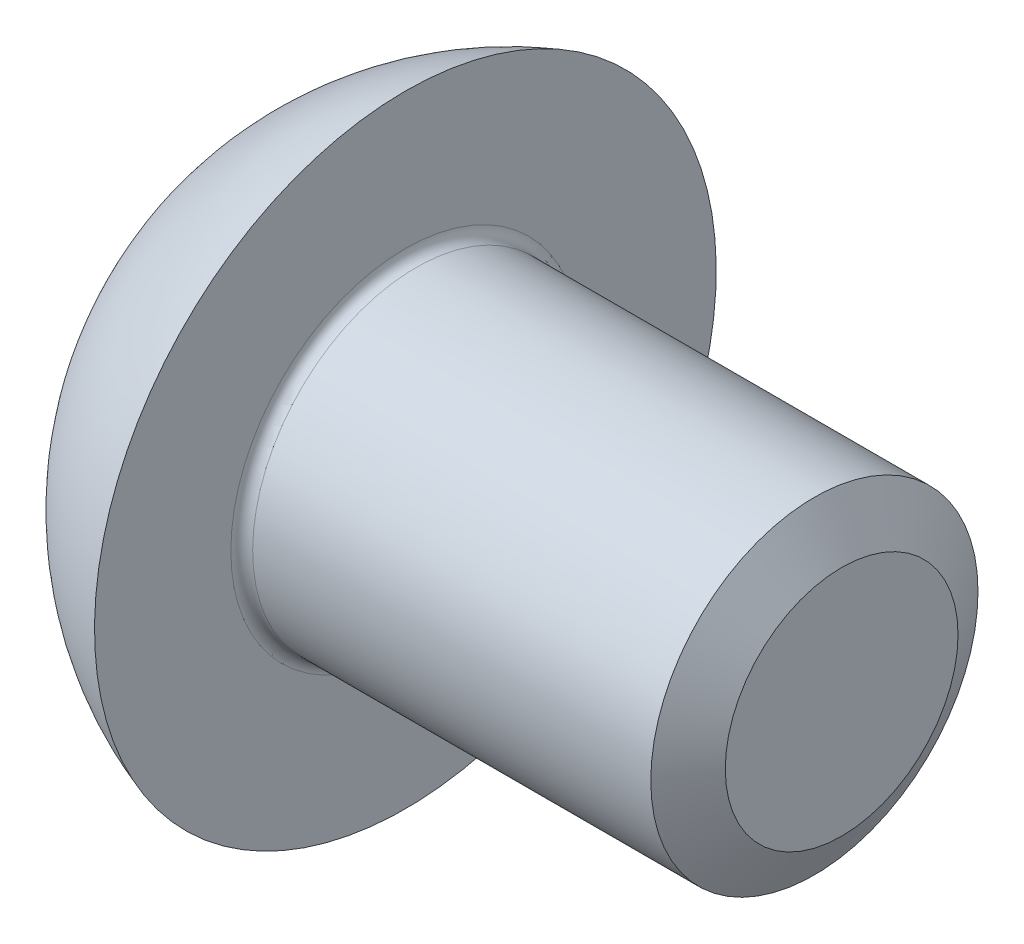
ISO-10303-21;
HEADER;
FILE_DESCRIPTION(('STEP AP214'),'2;1');
FILE_NAME('part.step','',(''),(''),'','','');
FILE_SCHEMA(('AUTOMOTIVE_DESIGN { 1 0 10303 214 1 1 1 1 }'));
ENDSEC;
DATA;
#1=APPLICATION_CONTEXT('core data for automotive mechanical design processes');
#2=APPLICATION_PROTOCOL_DEFINITION('international standard','automotive_design',2000,#1);
#3=PRODUCT_CONTEXT('',#1,'mechanical');
#4=PRODUCT('Part','Part','',(#3));
#5=PRODUCT_RELATED_PRODUCT_CATEGORY('part','',(#4));
#6=PRODUCT_DEFINITION_FORMATION('','',#4);
#7=PRODUCT_DEFINITION_CONTEXT('part definition',#1,'design');
#8=PRODUCT_DEFINITION('design','',#6,#7);
#9=PRODUCT_DEFINITION_SHAPE('','',#8);
#10=(LENGTH_UNIT() NAMED_UNIT(*) SI_UNIT(.MILLI.,.METRE.));
#11=(NAMED_UNIT(*) PLANE_ANGLE_UNIT() SI_UNIT($,.RADIAN.));
#12=(NAMED_UNIT(*) SI_UNIT($,.STERADIAN.) SOLID_ANGLE_UNIT());
#13=UNCERTAINTY_MEASURE_WITH_UNIT(LENGTH_MEASURE(1.E-05),#10,'distance_accuracy_value','');
#14=(GEOMETRIC_REPRESENTATION_CONTEXT(3) GLOBAL_UNCERTAINTY_ASSIGNED_CONTEXT((#13)) GLOBAL_UNIT_ASSIGNED_CONTEXT((#10,
#11,#12)) REPRESENTATION_CONTEXT('',''));
#15=CARTESIAN_POINT('',(0.,0.,0.));
#16=DIRECTION('',(0.,0.,1.));
#17=DIRECTION('',(1.,0.,0.));
#18=AXIS2_PLACEMENT_3D('',#15,#16,#17);
#19=CARTESIAN_POINT('',(-5.65,0.,0.));
#20=DIRECTION('',(-1.,0.,0.));
#21=DIRECTION('',(0.,0.,1.));
#22=AXIS2_PLACEMENT_3D('',#19,#20,#21);
#23=CYLINDRICAL_SURFACE('',#22,1.5);
#24=CARTESIAN_POINT('',(-3.9,0.,0.));
#25=DIRECTION('',(-1.,0.,0.));
#26=DIRECTION('',(0.,0.,1.));
#27=AXIS2_PLACEMENT_3D('',#24,#25,#26);
#28=CIRCLE('',#27,1.5);
#29=CARTESIAN_POINT('',(-3.9,0.,1.5));
#30=VERTEX_POINT('',#29);
#31=EDGE_CURVE('E248',#30,#30,#28,.T.);
#32=ORIENTED_EDGE('',*,*,#31,.F.);
#33=EDGE_LOOP('',(#32));
#34=FACE_BOUND('',#33,.T.);
#35=CARTESIAN_POINT('',(-0.25,0.,0.));
#36=DIRECTION('',(-1.,0.,0.));
#37=DIRECTION('',(0.,0.,1.));
#38=AXIS2_PLACEMENT_3D('',#35,#36,#37);
#39=CIRCLE('',#38,1.5);
#40=CARTESIAN_POINT('',(-0.25,0.,1.5));
#41=VERTEX_POINT('',#40);
#42=EDGE_CURVE('E387',#41,#41,#39,.T.);
#43=ORIENTED_EDGE('',*,*,#42,.T.);
#44=EDGE_LOOP('',(#43));
#45=FACE_BOUND('',#44,.T.);
#46=ADVANCED_FACE('F36',(#34,#45),#23,.T.);
#47=CARTESIAN_POINT('',(-5.65,0.,0.));
#48=DIRECTION('',(1.,0.,0.));
#49=DIRECTION('',(0.,0.,-1.));
#50=AXIS2_PLACEMENT_3D('',#47,#48,#49);
#51=PLANE('',#50);
#52=CARTESIAN_POINT('',(-5.65,0.,0.));
#53=DIRECTION('',(-1.,0.,0.));
#54=DIRECTION('',(0.,0.,1.));
#55=AXIS2_PLACEMENT_3D('',#52,#53,#54);
#56=CIRCLE('',#55,1.5);
#57=CARTESIAN_POINT('',(-5.65,1.5,0.));
#58=VERTEX_POINT('',#57);
#59=EDGE_CURVE('E240',#58,#58,#56,.T.);
#60=ORIENTED_EDGE('',*,*,#59,.T.);
#61=EDGE_LOOP('',(#60));
#62=FACE_BOUND('',#61,.T.);
#63=CARTESIAN_POINT('',(-5.65,0.,0.));
#64=DIRECTION('',(1.,0.,0.));
#65=DIRECTION('',(0.,0.,-1.));
#66=AXIS2_PLACEMENT_3D('',#63,#64,#65);
#67=CIRCLE('',#66,1.15470053837925);
#68=CARTESIAN_POINT('',(-5.65,-0.577350269189626,-1.));
#69=VERTEX_POINT('',#68);
#70=CARTESIAN_POINT('',(-5.65,-1.15470053837925,0.));
#71=VERTEX_POINT('',#70);
#72=EDGE_CURVE('E11',#69,#71,#67,.F.);
#73=ORIENTED_EDGE('',*,*,#72,.F.);
#74=CARTESIAN_POINT('',(-5.65,0.577350269189626,-1.));
#75=VERTEX_POINT('',#74);
#76=EDGE_CURVE('E40',#75,#69,#67,.F.);
#77=ORIENTED_EDGE('',*,*,#76,.F.);
#78=CARTESIAN_POINT('',(-5.65,1.15470053837925,0.));
#79=VERTEX_POINT('',#78);
#80=EDGE_CURVE('E109',#79,#75,#67,.F.);
#81=ORIENTED_EDGE('',*,*,#80,.F.);
#82=CARTESIAN_POINT('',(-5.65,0.,0.));
#83=DIRECTION('',(-1.,0.,0.));
#84=DIRECTION('',(0.,0.,1.));
#85=AXIS2_PLACEMENT_3D('',#82,#83,#84);
#86=CIRCLE('',#85,1.15470053837925);
#87=CARTESIAN_POINT('',(-5.65,0.577350269189627,1.));
#88=VERTEX_POINT('',#87);
#89=EDGE_CURVE('E129',#88,#79,#86,.T.);
#90=ORIENTED_EDGE('',*,*,#89,.F.);
#91=CARTESIAN_POINT('',(-5.65,-0.577350269189627,1.));
#92=VERTEX_POINT('',#91);
#93=EDGE_CURVE('E311',#92,#88,#67,.F.);
#94=ORIENTED_EDGE('',*,*,#93,.F.);
#95=EDGE_CURVE('E45',#71,#92,#67,.F.);
#96=ORIENTED_EDGE('',*,*,#95,.F.);
#97=EDGE_LOOP('',(#73,#77,#81,#90,#94,#96));
#98=FACE_BOUND('',#97,.T.);
#99=ADVANCED_FACE('F38',(#62,#98),#51,.F.);
#100=CARTESIAN_POINT('',(-3.04545454545455,0.,0.));
#101=DIRECTION('',(-1.,0.,0.));
#102=DIRECTION('',(0.,1.,0.));
#103=AXIS2_PLACEMENT_3D('',#100,#101,#102);
#104=SPHERICAL_SURFACE('',#103,3.00560426949281);
#105=CARTESIAN_POINT('',(-4.,0.,0.));
#106=DIRECTION('',(-1.,0.,0.));
#107=DIRECTION('',(0.,0.,1.));
#108=AXIS2_PLACEMENT_3D('',#105,#106,#107);
#109=CIRCLE('',#108,2.85);
#110=CARTESIAN_POINT('',(-4.,2.85,0.));
#111=VERTEX_POINT('',#110);
#112=EDGE_CURVE('E243',#111,#111,#109,.T.);
#113=CARTESIAN_POINT('',(-5.65,1.5,0.));
#114=CARTESIAN_POINT('',(-5.6386705331495,1.51967216925548,0.));
#115=CARTESIAN_POINT('',(-5.62711811082355,1.53921593268644,0.));
#116=CARTESIAN_POINT('',(-5.60357346441957,1.57803672196104,0.));
#117=CARTESIAN_POINT('',(-5.59158124034154,1.59731374780469,0.));
#118=CARTESIAN_POINT('',(-5.56716309963224,1.6355911359664,0.));
#119=CARTESIAN_POINT('',(-5.55473718300098,1.65459149828447,0.));
#120=CARTESIAN_POINT('',(-5.52945804954812,1.69230581219271,0.));
#121=CARTESIAN_POINT('',(-5.51660483272654,1.7110197637829,0.));
#122=CARTESIAN_POINT('',(-5.49047769442416,1.74815164624667,0.));
#123=CARTESIAN_POINT('',(-5.47720377294336,1.76656957712027,0.));
#124=CARTESIAN_POINT('',(-5.45024204119108,1.80309996277641,0.));
#125=CARTESIAN_POINT('',(-5.43655423091961,1.82121241755895,0.));
#126=CARTESIAN_POINT('',(-5.40877174878479,1.85712255178676,0.));
#127=CARTESIAN_POINT('',(-5.39467707692146,1.87492023123203,0.));
#128=CARTESIAN_POINT('',(-5.36608810800002,1.91019167733672,0.));
#129=CARTESIAN_POINT('',(-5.35159381094191,1.92766544399614,0.));
#130=CARTESIAN_POINT('',(-5.32221303311564,1.96228009332959,0.));
#131=CARTESIAN_POINT('',(-5.30732655234746,1.97942097600363,0.));
#132=CARTESIAN_POINT('',(-5.27716904995876,2.013361057086,0.));
#133=CARTESIAN_POINT('',(-5.26189802833824,2.03016025549433,0.));
#134=CARTESIAN_POINT('',(-5.2309792845233,2.06340834318511,0.));
#135=CARTESIAN_POINT('',(-5.21533156232888,2.07985723246756,0.));
#136=CARTESIAN_POINT('',(-5.18366745104768,2.11239625689921,0.));
#137=CARTESIAN_POINT('',(-5.16765106196089,2.12848639204841,0.));
#138=CARTESIAN_POINT('',(-5.13525783985292,2.16029964739355,0.));
#139=CARTESIAN_POINT('',(-5.11888100683174,2.17602276758948,0.));
#140=CARTESIAN_POINT('',(-5.08577530486826,2.2070939206369,0.));
#141=CARTESIAN_POINT('',(-5.06904643592596,2.22244195348839,0.));
#142=CARTESIAN_POINT('',(-5.03524525087184,2.25275505202893,0.));
#143=CARTESIAN_POINT('',(-5.01817293476004,2.26772011771799,0.));
#144=CARTESIAN_POINT('',(-4.98369362044743,2.29725959873447,0.));
#145=CARTESIAN_POINT('',(-4.96628662224662,2.3118340140619,0.));
#146=CARTESIAN_POINT('',(-4.93114688066531,2.34058471171934,0.));
#147=CARTESIAN_POINT('',(-4.9134141372848,2.35476099404935,0.));
#148=CARTESIAN_POINT('',(-4.87763200949386,2.38270814748122,0.));
#149=CARTESIAN_POINT('',(-4.85958262508344,2.39647901858308,0.));
#150=CARTESIAN_POINT('',(-4.82317648194882,2.42360827946968,0.));
#151=CARTESIAN_POINT('',(-4.80481972322463,2.43696666925442,0.));
#152=CARTESIAN_POINT('',(-4.76780825598736,2.46326410918943,0.));
#153=CARTESIAN_POINT('',(-4.74915354747428,2.4762031593397,0.));
#154=CARTESIAN_POINT('',(-4.7115557581542,2.50165527698115,0.));
#155=CARTESIAN_POINT('',(-4.69261267734721,2.51416834447232,0.));
#156=CARTESIAN_POINT('',(-4.65444786898723,2.53876207247436,0.));
#157=CARTESIAN_POINT('',(-4.63522614143426,2.55084273298524,0.));
#158=CARTESIAN_POINT('',(-4.59651390818984,2.57456544470666,0.));
#159=CARTESIAN_POINT('',(-4.5770234024984,2.5862074959172,0.));
#160=CARTESIAN_POINT('',(-4.53778361957831,2.60904701190566,0.));
#161=CARTESIAN_POINT('',(-4.51803434234967,2.62024447668356,0.));
#162=CARTESIAN_POINT('',(-4.4782871558097,2.6421890709225,0.));
#163=CARTESIAN_POINT('',(-4.45828924649837,2.65293620038353,0.));
#164=CARTESIAN_POINT('',(-4.41805506290636,2.67397460633529,0.));
#165=CARTESIAN_POINT('',(-4.39781878862568,2.68426588282604,0.));
#166=CARTESIAN_POINT('',(-4.3571182645539,2.70438729913089,0.));
#167=CARTESIAN_POINT('',(-4.3366540147628,2.714217438945,0.));
#168=CARTESIAN_POINT('',(-4.29550804629742,2.73341153528513,0.));
#169=CARTESIAN_POINT('',(-4.27482632762314,2.74277549181114,0.));
#170=CARTESIAN_POINT('',(-4.23325603920768,2.7610324130256,0.));
#171=CARTESIAN_POINT('',(-4.2123674694665,2.76992537771405,0.));
#172=CARTESIAN_POINT('',(-4.17039420465488,2.78723575329491,0.));
#173=CARTESIAN_POINT('',(-4.14930950958444,2.79565316418733,0.));
#174=CARTESIAN_POINT('',(-4.10695481411716,2.81200809653372,0.));
#175=CARTESIAN_POINT('',(-4.08568481372031,2.8199456179877,0.));
#176=CARTESIAN_POINT('',(-4.04297044672759,2.83533674876495,0.));
#177=CARTESIAN_POINT('',(-4.02152608013171,2.84279035808822,0.));
#178=CARTESIAN_POINT('',(-4.,2.85,0.));
#179=B_SPLINE_CURVE_WITH_KNOTS('',3,(#113,#114,#115,#116,#117,#118,#119,#120,#121,#122,#123,
#124,#125,#126,#127,#128,#129,#130,#131,#132,#133,#134,#135,#136,#137,#138,#139,#140,#141,#142,
#143,#144,#145,#146,#147,#148,#149,#150,#151,#152,#153,#154,#155,#156,#157,#158,#159,#160,#161,
#162,#163,#164,#165,#166,#167,#168,#169,#170,#171,#172,#173,#174,#175,#176,#177,#178),
.UNSPECIFIED.,.F.,.F.,(4,2,2,2,2,2,2,2,2,2,2,2,2,2,2,2,2,2,2,2,2,2,2,2,2,2,2,2,2,2,2,2,4),(0.,
0.0681025747754097,0.13620514955082,0.204307724326229,0.272410299101638,0.340512873877048,
0.408615448652458,0.476718023427867,0.544820598203277,0.612923172978687,0.681025747754096,
0.749128322529506,0.817230897304915,0.885333472080325,0.953436046855735,1.02153862163114,
1.08964119640655,1.15774377118196,1.22584634595737,1.29394892073278,1.36205149550819,
1.4301540702836,1.49825664505901,1.56635921983442,1.63446179460983,1.70256436938524,
1.77066694416065,1.83876951893606,1.90687209371147,1.97497466848688,2.04307724326229,
2.1111798180377,2.17928239281311),.UNSPECIFIED.);
#180=EDGE_CURVE('BSEAM229',#58,#111,#179,.T.);
#181=ORIENTED_EDGE('',*,*,#59,.F.);
#182=ORIENTED_EDGE('',*,*,#112,.T.);
#183=ORIENTED_EDGE('',*,*,#180,.T.);
#184=ORIENTED_EDGE('',*,*,#180,.F.);
#185=EDGE_LOOP('',(#181,#183,#182,#184));
#186=FACE_BOUND('',#185,.T.);
#187=ADVANCED_FACE('F229',(#186),#104,.T.);
#188=CARTESIAN_POINT('',(-4.,1.6,0.));
#189=DIRECTION('',(-1.,0.,0.));
#190=DIRECTION('',(0.,0.,1.));
#191=AXIS2_PLACEMENT_3D('',#188,#189,#190);
#192=PLANE('',#191);
#193=ORIENTED_EDGE('',*,*,#112,.F.);
#194=EDGE_LOOP('',(#193));
#195=FACE_BOUND('',#194,.T.);
#196=CARTESIAN_POINT('',(-4.,0.,0.));
#197=DIRECTION('',(-1.,0.,0.));
#198=DIRECTION('',(0.,0.,1.));
#199=AXIS2_PLACEMENT_3D('',#196,#197,#198);
#200=CIRCLE('',#199,1.6);
#201=CARTESIAN_POINT('',(-4.,0.,1.6));
#202=VERTEX_POINT('',#201);
#203=EDGE_CURVE('E244',#202,#202,#200,.T.);
#204=ORIENTED_EDGE('',*,*,#203,.T.);
#205=EDGE_LOOP('',(#204));
#206=FACE_BOUND('',#205,.T.);
#207=ADVANCED_FACE('F226',(#195,#206),#192,.F.);
#208=CARTESIAN_POINT('',(-3.9,0.,0.));
#209=DIRECTION('',(-1.,0.,0.));
#210=DIRECTION('',(0.,0.,1.));
#211=AXIS2_PLACEMENT_3D('',#208,#209,#210);
#212=TOROIDAL_SURFACE('',#211,1.6,0.1);
#213=ORIENTED_EDGE('',*,*,#203,.F.);
#214=EDGE_LOOP('',(#213));
#215=FACE_BOUND('',#214,.T.);
#216=ORIENTED_EDGE('',*,*,#31,.T.);
#217=EDGE_LOOP('',(#216));
#218=FACE_BOUND('',#217,.T.);
#219=ADVANCED_FACE('F223',(#215,#218),#212,.F.);
#220=CARTESIAN_POINT('',(-5.35,0.,0.));
#221=DIRECTION('',(-1.,0.,0.));
#222=DIRECTION('',(0.,0.,1.));
#223=AXIS2_PLACEMENT_3D('',#220,#221,#222);
#224=CONICAL_SURFACE('',#223,0.,1.31660847419538);
#225=CARTESIAN_POINT('',(-5.82013380620057,-1.50813004514732,-1.));
#226=CARTESIAN_POINT('',(-5.8103550434819,-1.46296169562474,-1.));
#227=CARTESIAN_POINT('',(-5.80070106345438,-1.41776633026117,-1.));
#228=CARTESIAN_POINT('',(-5.78170572496956,-1.32730802014364,-1.));
#229=CARTESIAN_POINT('',(-5.77236437982312,-1.28204507259777,-1.));
#230=CARTESIAN_POINT('',(-5.74488770712419,-1.14605409329119,-1.));
#231=CARTESIAN_POINT('',(-5.72731859349988,-1.05520983561614,-1.));
#232=CARTESIAN_POINT('',(-5.69461131204395,-0.873838301576798,-1.));
#233=CARTESIAN_POINT('',(-5.67945456692474,-0.7833144391517,-1.));
#234=CARTESIAN_POINT('',(-5.65260008692449,-0.6017545449599,-1.));
#235=CARTESIAN_POINT('',(-5.64090169604817,-0.510718613667323,-1.));
#236=CARTESIAN_POINT('',(-5.62246881045803,-0.327147289356503,-1.));
#237=CARTESIAN_POINT('',(-5.61578776188075,-0.234606191513628,-1.));
#238=CARTESIAN_POINT('',(-5.60903683627844,-0.0493046545659397,-1.));
#239=CARTESIAN_POINT('',(-5.60896400245972,0.0434556678685438,-1.));
#240=CARTESIAN_POINT('',(-5.61545349340013,0.229083736366357,-1.));
#241=CARTESIAN_POINT('',(-5.62204147369897,0.321950511068641,-1.));
#242=CARTESIAN_POINT('',(-5.64045721399818,0.507192547760969,-1.));
#243=CARTESIAN_POINT('',(-5.65228848162608,0.599567438757552,-1.));
#244=CARTESIAN_POINT('',(-5.67981183132388,0.785811374464127,-1.));
#245=CARTESIAN_POINT('',(-5.69558360308727,0.879668211118268,-1.));
#246=CARTESIAN_POINT('',(-5.72952329669545,1.06695285362325,-1.));
#247=CARTESIAN_POINT('',(-5.74769157874278,1.1603805927907,-1.));
#248=CARTESIAN_POINT('',(-5.78558531632585,1.34694314931586,-1.));
#249=CARTESIAN_POINT('',(-5.80531120299549,1.44007787810024,-1.));
#250=CARTESIAN_POINT('',(-5.84579713231761,1.62612272775573,-1.));
#251=CARTESIAN_POINT('',(-5.86655719608256,1.71903284400079,-1.));
#252=CARTESIAN_POINT('',(-5.90854857428718,1.903637427562,-1.));
#253=CARTESIAN_POINT('',(-5.92977186893612,1.9953337266767,-1.));
#254=CARTESIAN_POINT('',(-5.97271430581896,2.17861191613063,-1.));
#255=CARTESIAN_POINT('',(-5.99443345860857,2.27019380399046,-1.));
#256=CARTESIAN_POINT('',(-6.03820424205131,2.45314970808009,-1.));
#257=CARTESIAN_POINT('',(-6.06025539436552,2.5445238389853,-1.));
#258=CARTESIAN_POINT('',(-6.10463324721372,2.72720190611077,-1.));
#259=CARTESIAN_POINT('',(-6.12695993831944,2.8185058446199,-1.));
#260=CARTESIAN_POINT('',(-6.14938266954955,2.90978592155446,-1.));
#261=B_SPLINE_CURVE_WITH_KNOTS('',3,(#225,#226,#227,#228,#229,#230,#231,#232,#233,#234,#235,
#236,#237,#238,#239,#240,#241,#242,#243,#244,#245,#246,#247,#248,#249,#250,#251,#252,#253,#254,
#255,#256,#257,#258,#259,#260),.UNSPECIFIED.,.F.,.F.,(4,2,2,2,2,2,2,2,2,2,2,2,2,2,2,2,2,4),(0.,
0.138643869904216,0.27729363526202,0.554857004575374,0.830167022867761,1.1054247856322,
1.38357462949425,1.66160001678322,1.94070037290081,2.2199877226546,2.50545939054028,
2.79097401465123,3.07656794608524,3.36216771024121,3.64452690734654,3.92689212086077,
4.20888343572446,4.49086512814071),.UNSPECIFIED.);
#262=EDGE_CURVE('E100',#69,#75,#261,.T.);
#263=ORIENTED_EDGE('',*,*,#262,.T.);
#264=ORIENTED_EDGE('',*,*,#76,.T.);
#265=EDGE_LOOP('',(#263,#264));
#266=FACE_BOUND('',#265,.T.);
#267=ADVANCED_FACE('F104',(#266),#224,.F.);
#268=CARTESIAN_POINT('',(-5.65003000449955,0.577234799135788,-1.0002));
#269=CARTESIAN_POINT('',(-5.64379291920422,0.6012250217386,-0.958647715567044));
#270=CARTESIAN_POINT('',(-5.63813137861672,0.625256195021441,-0.917024502475671));
#271=CARTESIAN_POINT('',(-5.62818542172232,0.673398386330439,-0.833639781140784));
#272=CARTESIAN_POINT('',(-5.6239015302713,0.697509431260084,-0.791878226299064));
#273=CARTESIAN_POINT('',(-5.61695890316674,0.745673772514855,-0.708455140132714));
#274=CARTESIAN_POINT('',(-5.6142923745456,0.769726780462717,-0.666794108292159));
#275=CARTESIAN_POINT('',(-5.61071689299408,0.817861664223349,-0.583422044002323));
#276=CARTESIAN_POINT('',(-5.60980762113533,0.841943534003894,-0.541711022001161));
#277=CARTESIAN_POINT('',(-5.60980762113533,0.890107273564984,-0.458288977998839));
#278=CARTESIAN_POINT('',(-5.61071689299408,0.914189143345529,-0.416577955997677));
#279=CARTESIAN_POINT('',(-5.6142923745456,0.962324027106161,-0.333205891707841));
#280=CARTESIAN_POINT('',(-5.61695890316674,0.986377035054023,-0.291544859867286));
#281=CARTESIAN_POINT('',(-5.6239015302713,1.03454137630879,-0.208121773700936));
#282=CARTESIAN_POINT('',(-5.62818542172232,1.05865242123844,-0.166360218859216));
#283=CARTESIAN_POINT('',(-5.63813137861672,1.10679461254744,-0.0829754975243291));
#284=CARTESIAN_POINT('',(-5.64379291920422,1.13082578583028,-0.0413522844329564));
#285=CARTESIAN_POINT('',(-5.65003000449955,1.15481600843309,0.000199999999999949));
#286=B_SPLINE_CURVE_WITH_KNOTS('',3,(#268,#269,#270,#271,#272,#273,#274,#275,#276,#277,#278,
#279,#280,#281,#282,#283,#284,#285),.UNSPECIFIED.,.F.,.F.,(4,2,2,2,2,2,2,2,4),(0.,
0.145159524820137,0.290374287087485,0.434883682122849,0.57936684736763,0.723850012612412,
0.868359407647776,1.01357416991512,1.15873369473526),.UNSPECIFIED.);
#287=EDGE_CURVE('E127',#75,#79,#286,.T.);
#288=ORIENTED_EDGE('',*,*,#287,.T.);
#289=ORIENTED_EDGE('',*,*,#80,.T.);
#290=EDGE_LOOP('',(#288,#289));
#291=FACE_BOUND('',#290,.T.);
#292=ADVANCED_FACE('F153',(#291),#224,.F.);
#293=CARTESIAN_POINT('',(-5.65003000449955,1.15481600843309,-0.000199999999999906));
#294=CARTESIAN_POINT('',(-5.64379291920422,1.13082578583028,0.0413522844329562));
#295=CARTESIAN_POINT('',(-5.63813137861672,1.10679461254744,0.0829754975243289));
#296=CARTESIAN_POINT('',(-5.62818542172232,1.05865242123844,0.166360218859216));
#297=CARTESIAN_POINT('',(-5.6239015302713,1.03454137630879,0.208121773700936));
#298=CARTESIAN_POINT('',(-5.61695890316674,0.986377035054023,0.291544859867286));
#299=CARTESIAN_POINT('',(-5.6142923745456,0.962324027106161,0.333205891707841));
#300=CARTESIAN_POINT('',(-5.61071689299408,0.914189143345529,0.416577955997677));
#301=CARTESIAN_POINT('',(-5.60980762113533,0.890107273564984,0.458288977998838));
#302=CARTESIAN_POINT('',(-5.60980762113533,0.841943534003894,0.541711022001161));
#303=CARTESIAN_POINT('',(-5.61071689299408,0.817861664223349,0.583422044002323));
#304=CARTESIAN_POINT('',(-5.6142923745456,0.769726780462718,0.666794108292159));
#305=CARTESIAN_POINT('',(-5.61695890316674,0.745673772514856,0.708455140132714));
#306=CARTESIAN_POINT('',(-5.6239015302713,0.697509431260084,0.791878226299063));
#307=CARTESIAN_POINT('',(-5.62818542172232,0.67339838633044,0.833639781140784));
#308=CARTESIAN_POINT('',(-5.63813137861672,0.625256195021441,0.917024502475671));
#309=CARTESIAN_POINT('',(-5.64379291920422,0.6012250217386,0.958647715567044));
#310=CARTESIAN_POINT('',(-5.65003000449955,0.577234799135789,1.0002));
#311=B_SPLINE_CURVE_WITH_KNOTS('',3,(#293,#294,#295,#296,#297,#298,#299,#300,#301,#302,#303,
#304,#305,#306,#307,#308,#309,#310),.UNSPECIFIED.,.F.,.F.,(4,2,2,2,2,2,2,2,4),(0.,
0.145159524820137,0.290374287087485,0.434883682122849,0.57936684736763,0.723850012612411,
0.868359407647776,1.01357416991512,1.15873369473526),.UNSPECIFIED.);
#312=EDGE_CURVE('E173',#79,#88,#311,.T.);
#313=ORIENTED_EDGE('',*,*,#312,.T.);
#314=ORIENTED_EDGE('',*,*,#89,.T.);
#315=EDGE_LOOP('',(#313,#314));
#316=FACE_BOUND('',#315,.T.);
#317=ADVANCED_FACE('F147',(#316),#224,.F.);
#318=CARTESIAN_POINT('',(-5.82013380620057,-1.50813004514732,1.));
#319=CARTESIAN_POINT('',(-5.8103550434819,-1.46296169562475,1.));
#320=CARTESIAN_POINT('',(-5.80070106345438,-1.41776633026117,1.));
#321=CARTESIAN_POINT('',(-5.78170572496956,-1.32730802014364,1.));
#322=CARTESIAN_POINT('',(-5.77236437982312,-1.28204507259777,1.));
#323=CARTESIAN_POINT('',(-5.74488770712419,-1.14605409329119,1.));
#324=CARTESIAN_POINT('',(-5.72731859349988,-1.05520983561614,1.));
#325=CARTESIAN_POINT('',(-5.69461131204395,-0.873838301576799,1.));
#326=CARTESIAN_POINT('',(-5.67945456692474,-0.783314439151701,1.));
#327=CARTESIAN_POINT('',(-5.65260008692449,-0.601754544959901,1.));
#328=CARTESIAN_POINT('',(-5.64090169604817,-0.510718613667323,1.));
#329=CARTESIAN_POINT('',(-5.62246881045803,-0.327147289356504,1.));
#330=CARTESIAN_POINT('',(-5.61578776188075,-0.234606191513628,1.));
#331=CARTESIAN_POINT('',(-5.60903683627844,-0.0493046545659398,1.));
#332=CARTESIAN_POINT('',(-5.60896400245972,0.0434556678685437,1.));
#333=CARTESIAN_POINT('',(-5.61545349340013,0.229083736366357,1.));
#334=CARTESIAN_POINT('',(-5.62204147369897,0.321950511068641,1.));
#335=CARTESIAN_POINT('',(-5.64045721399818,0.507192547760969,1.));
#336=CARTESIAN_POINT('',(-5.65228848162608,0.599567438757551,1.));
#337=CARTESIAN_POINT('',(-5.67981183132388,0.785811374464126,1.));
#338=CARTESIAN_POINT('',(-5.69558360308727,0.879668211118267,1.));
#339=CARTESIAN_POINT('',(-5.72952329669545,1.06695285362324,1.));
#340=CARTESIAN_POINT('',(-5.74769157874278,1.1603805927907,0.999999999999999));
#341=CARTESIAN_POINT('',(-5.78558531632585,1.34694314931586,0.999999999999999));
#342=CARTESIAN_POINT('',(-5.80531120299549,1.44007787810024,0.999999999999999));
#343=CARTESIAN_POINT('',(-5.84579713231761,1.62612272775573,0.999999999999999));
#344=CARTESIAN_POINT('',(-5.86655719608256,1.71903284400079,0.999999999999999));
#345=CARTESIAN_POINT('',(-5.90854857428718,1.903637427562,0.999999999999999));
#346=CARTESIAN_POINT('',(-5.92977186893612,1.9953337266767,0.999999999999999));
#347=CARTESIAN_POINT('',(-5.97271430581896,2.17861191613063,0.999999999999999));
#348=CARTESIAN_POINT('',(-5.99443345860857,2.27019380399046,0.999999999999999));
#349=CARTESIAN_POINT('',(-6.03820424205131,2.45314970808009,0.999999999999999));
#350=CARTESIAN_POINT('',(-6.06025539436552,2.5445238389853,0.999999999999999));
#351=CARTESIAN_POINT('',(-6.10463324721372,2.72720190611077,0.999999999999999));
#352=CARTESIAN_POINT('',(-6.12695993831944,2.81850584461991,0.999999999999999));
#353=CARTESIAN_POINT('',(-6.14938266954955,2.90978592155446,0.999999999999999));
#354=B_SPLINE_CURVE_WITH_KNOTS('',3,(#318,#319,#320,#321,#322,#323,#324,#325,#326,#327,#328,
#329,#330,#331,#332,#333,#334,#335,#336,#337,#338,#339,#340,#341,#342,#343,#344,#345,#346,#347,
#348,#349,#350,#351,#352,#353),.UNSPECIFIED.,.F.,.F.,(4,2,2,2,2,2,2,2,2,2,2,2,2,2,2,2,2,4),(0.,
0.138643869904216,0.27729363526202,0.554857004575374,0.83016702286776,1.1054247856322,
1.38357462949425,1.66160001678322,1.94070037290081,2.2199877226546,2.50545939054028,
2.79097401465123,3.07656794608524,3.36216771024121,3.64452690734654,3.92689212086077,
4.20888343572446,4.49086512814071),.UNSPECIFIED.);
#355=EDGE_CURVE('E57',#88,#92,#354,.F.);
#356=ORIENTED_EDGE('',*,*,#355,.T.);
#357=ORIENTED_EDGE('',*,*,#93,.T.);
#358=EDGE_LOOP('',(#356,#357));
#359=FACE_BOUND('',#358,.T.);
#360=ADVANCED_FACE('F152',(#359),#224,.F.);
#361=CARTESIAN_POINT('',(-5.65003000449955,-0.577234799135789,1.0002));
#362=CARTESIAN_POINT('',(-5.64379291920422,-0.6012250217386,0.958647715567044));
#363=CARTESIAN_POINT('',(-5.63813137861672,-0.625256195021441,0.917024502475671));
#364=CARTESIAN_POINT('',(-5.62818542172232,-0.67339838633044,0.833639781140784));
#365=CARTESIAN_POINT('',(-5.6239015302713,-0.697509431260084,0.791878226299064));
#366=CARTESIAN_POINT('',(-5.61695890316674,-0.745673772514856,0.708455140132714));
#367=CARTESIAN_POINT('',(-5.6142923745456,-0.769726780462717,0.666794108292159));
#368=CARTESIAN_POINT('',(-5.61071689299408,-0.817861664223349,0.583422044002322));
#369=CARTESIAN_POINT('',(-5.60980762113533,-0.841943534003894,0.541711022001161));
#370=CARTESIAN_POINT('',(-5.60980762113533,-0.890107273564984,0.458288977998838));
#371=CARTESIAN_POINT('',(-5.61071689299408,-0.914189143345529,0.416577955997677));
#372=CARTESIAN_POINT('',(-5.6142923745456,-0.962324027106161,0.333205891707841));
#373=CARTESIAN_POINT('',(-5.61695890316674,-0.986377035054023,0.291544859867286));
#374=CARTESIAN_POINT('',(-5.6239015302713,-1.03454137630879,0.208121773700936));
#375=CARTESIAN_POINT('',(-5.62818542172232,-1.05865242123844,0.166360218859216));
#376=CARTESIAN_POINT('',(-5.63813137861672,-1.10679461254744,0.0829754975243289));
#377=CARTESIAN_POINT('',(-5.64379291920422,-1.13082578583028,0.0413522844329561));
#378=CARTESIAN_POINT('',(-5.65003000449955,-1.15481600843309,-0.000200000000000019));
#379=B_SPLINE_CURVE_WITH_KNOTS('',3,(#361,#362,#363,#364,#365,#366,#367,#368,#369,#370,#371,
#372,#373,#374,#375,#376,#377,#378),.UNSPECIFIED.,.F.,.F.,(4,2,2,2,2,2,2,2,4),(0.,
0.145159524820138,0.290374287087485,0.43488368212285,0.579366847367631,0.723850012612412,
0.868359407647776,1.01357416991512,1.15873369473526),.UNSPECIFIED.);
#380=EDGE_CURVE('E51',#92,#71,#379,.T.);
#381=ORIENTED_EDGE('',*,*,#380,.T.);
#382=ORIENTED_EDGE('',*,*,#95,.T.);
#383=EDGE_LOOP('',(#381,#382));
#384=FACE_BOUND('',#383,.T.);
#385=ADVANCED_FACE('F297',(#384),#224,.F.);
#386=CARTESIAN_POINT('',(-5.65003000449955,-1.15481600843309,0.000199999999999781));
#387=CARTESIAN_POINT('',(-5.64379291920422,-1.13082578583028,-0.0413522844329564));
#388=CARTESIAN_POINT('',(-5.63813137861672,-1.10679461254744,-0.0829754975243292));
#389=CARTESIAN_POINT('',(-5.62818542172232,-1.05865242123844,-0.166360218859216));
#390=CARTESIAN_POINT('',(-5.6239015302713,-1.03454137630879,-0.208121773700936));
#391=CARTESIAN_POINT('',(-5.61695890316674,-0.986377035054023,-0.291544859867286));
#392=CARTESIAN_POINT('',(-5.6142923745456,-0.962324027106161,-0.333205891707841));
#393=CARTESIAN_POINT('',(-5.61071689299408,-0.914189143345529,-0.416577955997677));
#394=CARTESIAN_POINT('',(-5.60980762113533,-0.890107273564984,-0.458288977998839));
#395=CARTESIAN_POINT('',(-5.60980762113533,-0.841943534003894,-0.541711022001162));
#396=CARTESIAN_POINT('',(-5.61071689299408,-0.817861664223349,-0.583422044002323));
#397=CARTESIAN_POINT('',(-5.6142923745456,-0.769726780462717,-0.66679410829216));
#398=CARTESIAN_POINT('',(-5.61695890316674,-0.745673772514855,-0.708455140132714));
#399=CARTESIAN_POINT('',(-5.6239015302713,-0.697509431260084,-0.791878226299064));
#400=CARTESIAN_POINT('',(-5.62818542172232,-0.673398386330439,-0.833639781140785));
#401=CARTESIAN_POINT('',(-5.63813137861672,-0.62525619502144,-0.917024502475671));
#402=CARTESIAN_POINT('',(-5.64379291920422,-0.601225021738599,-0.958647715567044));
#403=CARTESIAN_POINT('',(-5.65003000449955,-0.577234799135788,-1.0002));
#404=B_SPLINE_CURVE_WITH_KNOTS('',3,(#386,#387,#388,#389,#390,#391,#392,#393,#394,#395,#396,
#397,#398,#399,#400,#401,#402,#403),.UNSPECIFIED.,.F.,.F.,(4,2,2,2,2,2,2,2,4),(0.,
0.145159524820138,0.290374287087485,0.43488368212285,0.579366847367631,0.723850012612412,
0.868359407647777,1.01357416991512,1.15873369473526),.UNSPECIFIED.);
#405=EDGE_CURVE('E92',#71,#69,#404,.T.);
#406=ORIENTED_EDGE('',*,*,#405,.T.);
#407=ORIENTED_EDGE('',*,*,#72,.T.);
#408=EDGE_LOOP('',(#406,#407));
#409=FACE_BOUND('',#408,.T.);
#410=ADVANCED_FACE('F94',(#409),#224,.F.);
#411=CARTESIAN_POINT('',(-4.61,0.,0.));
#412=DIRECTION('',(-1.,0.,0.));
#413=DIRECTION('',(0.,0.,1.));
#414=AXIS2_PLACEMENT_3D('',#411,#412,#413);
#415=CONICAL_SURFACE('',#414,1.15470053837925,1.08478502970569);
#416=CARTESIAN_POINT('',(-4.,0.,0.));
#417=VERTEX_POINT('',#416);
#418=VERTEX_LOOP('',#417);
#419=FACE_BOUND('',#418,.T.);
#420=CARTESIAN_POINT('',(-4.95337776846668,-1.50230992902256,1.));
#421=CARTESIAN_POINT('',(-4.93404447709846,-1.45833854212792,1.));
#422=CARTESIAN_POINT('',(-4.91492324688892,-1.41427434371369,1.));
#423=CARTESIAN_POINT('',(-4.87721630605534,-1.32590919945493,1.));
#424=CARTESIAN_POINT('',(-4.85863068312767,-1.28160821623293,1.));
#425=CARTESIAN_POINT('',(-4.80366814792039,-1.14784319746715,1.));
#426=CARTESIAN_POINT('',(-4.76828448055695,-1.0579632127042,1.));
#427=CARTESIAN_POINT('',(-4.7014887266079,-0.876123438303668,1.));
#428=CARTESIAN_POINT('',(-4.67010099385229,-0.784154579064022,1.));
#429=CARTESIAN_POINT('',(-4.61426989268055,-0.598229842536456,1.));
#430=CARTESIAN_POINT('',(-4.58981126373078,-0.504278829243042,1.));
#431=CARTESIAN_POINT('',(-4.56128421129495,-0.361662527224941,1.));
#432=CARTESIAN_POINT('',(-4.55313365373501,-0.313821896860822,1.));
#433=CARTESIAN_POINT('',(-4.54009013835726,-0.217683951650819,1.));
#434=CARTESIAN_POINT('',(-4.53519738548625,-0.169386608267164,1.));
#435=CARTESIAN_POINT('',(-4.52906892169682,-0.0727543491389224,1.));
#436=CARTESIAN_POINT('',(-4.52781819078401,-0.0244204123550071,1.));
#437=CARTESIAN_POINT('',(-4.52903404619749,0.0721832272140566,1.));
#438=CARTESIAN_POINT('',(-4.53149961154434,0.120452943996259,1.));
#439=CARTESIAN_POINT('',(-4.54268581999238,0.247728097144402,1.));
#440=CARTESIAN_POINT('',(-4.55441562635751,0.326472817262408,1.));
#441=CARTESIAN_POINT('',(-4.5853155073682,0.48261102963908,1.));
#442=CARTESIAN_POINT('',(-4.60450541588021,0.560000340271394,1.));
#443=CARTESIAN_POINT('',(-4.64844209500575,0.714868516301326,1.));
#444=CARTESIAN_POINT('',(-4.6732951432692,0.792316418279872,1.));
#445=CARTESIAN_POINT('',(-4.71314935006588,0.907307575947511,1.));
#446=CARTESIAN_POINT('',(-4.72681730241483,0.94532619210618,1.));
#447=CARTESIAN_POINT('',(-4.75487650057496,1.02108213746788,1.));
#448=CARTESIAN_POINT('',(-4.76926751148051,1.05881955350961,1.));
#449=CARTESIAN_POINT('',(-4.78394894242493,1.09644387732909,1.));
#450=B_SPLINE_CURVE_WITH_KNOTS('',3,(#420,#421,#422,#423,#424,#425,#426,#427,#428,#429,#430,
#431,#432,#433,#434,#435,#436,#437,#438,#439,#440,#441,#442,#443,#444,#445,#446,#447,#448,#449),
.UNSPECIFIED.,.F.,.F.,(4,2,2,2,2,2,2,2,2,2,2,2,2,2,4),(0.,0.144099688367162,0.288222838023382,
0.577934103063665,0.869334177423657,1.16008739774032,1.30558498623474,1.45109172704164,
1.59599753038748,1.74086353096461,1.97918577008464,2.21814600843204,2.46202630696738,
2.58322416234258,2.70438289467142),.UNSPECIFIED.);
#451=CARTESIAN_POINT('',(-4.61,-0.577350269189626,1.));
#452=VERTEX_POINT('',#451);
#453=CARTESIAN_POINT('',(-4.61,0.577350269189627,1.));
#454=VERTEX_POINT('',#453);
#455=EDGE_CURVE('E188',#452,#454,#450,.T.);
#456=ORIENTED_EDGE('',*,*,#455,.T.);
#457=CARTESIAN_POINT('',(-4.61006100914909,0.577234799135789,1.0002));
#458=CARTESIAN_POINT('',(-4.59674716756238,0.602421402936658,0.956575522546787));
#459=CARTESIAN_POINT('',(-4.58464843666655,0.627789970277025,0.912635874998038));
#460=CARTESIAN_POINT('',(-4.5635159299897,0.678892423428091,0.824123829748984));
#461=CARTESIAN_POINT('',(-4.55448814518534,0.704626922430506,0.77955036996947));
#462=CARTESIAN_POINT('',(-4.54033689959432,0.755829480104157,0.690864938601231));
#463=CARTESIAN_POINT('',(-4.53513654517591,0.781292040133179,0.646762490940193));
#464=CARTESIAN_POINT('',(-4.52879891022451,0.8323219345157,0.558376121164793));
#465=CARTESIAN_POINT('',(-4.52765764758696,0.85788914153431,0.514092419600929));
#466=CARTESIAN_POINT('',(-4.52942932034743,0.906140287040706,0.430518984060451));
#467=CARTESIAN_POINT('',(-4.53190541168453,0.92882859971846,0.391221673764573));
#468=CARTESIAN_POINT('',(-4.53995672886741,0.974082594298355,0.312839455906748));
#469=CARTESIAN_POINT('',(-4.54553433046891,0.996648168786444,0.273754734391397));
#470=CARTESIAN_POINT('',(-4.55955566979136,1.04198502975731,0.195228987734174));
#471=CARTESIAN_POINT('',(-4.56805139707942,1.06475218926301,0.155795110726277));
#472=CARTESIAN_POINT('',(-4.58740312215583,1.1099976059254,0.0774277502573927));
#473=CARTESIAN_POINT('',(-4.59825526094316,1.13247627253034,0.0384935576112355));
#474=CARTESIAN_POINT('',(-4.61006100914909,1.15481600843309,-0.000199999999999808));
#475=B_SPLINE_CURVE_WITH_KNOTS('',3,(#457,#458,#459,#460,#461,#462,#463,#464,#465,#466,#467,
#468,#469,#470,#471,#472,#473,#474),.UNSPECIFIED.,.F.,.F.,(4,2,2,2,2,2,2,2,4),(0.,
0.156356652206859,0.313016607627113,0.466436255933325,0.619705352863253,0.755925705289371,
0.892250546480127,1.03114227500706,1.16980823889878),.UNSPECIFIED.);
#476=CARTESIAN_POINT('',(-4.61,1.15470053837925,0.));
#477=VERTEX_POINT('',#476);
#478=EDGE_CURVE('E195',#454,#477,#475,.T.);
#479=ORIENTED_EDGE('',*,*,#478,.T.);
#480=CARTESIAN_POINT('',(-4.61006100914909,1.15481600843309,0.000200000000000064));
#481=CARTESIAN_POINT('',(-4.59674716756238,1.12962940463222,-0.0434244774532127));
#482=CARTESIAN_POINT('',(-4.58464843666655,1.10426083729185,-0.0873641250019613));
#483=CARTESIAN_POINT('',(-4.5635159299897,1.05315838414079,-0.175876170251015));
#484=CARTESIAN_POINT('',(-4.55448814518534,1.02742388513837,-0.220449630030529));
#485=CARTESIAN_POINT('',(-4.54033689959432,0.976221327464721,-0.309135061398768));
#486=CARTESIAN_POINT('',(-4.53513654517591,0.9507587674357,-0.353237509059806));
#487=CARTESIAN_POINT('',(-4.52879891022451,0.899728873053179,-0.441623878835207));
#488=CARTESIAN_POINT('',(-4.52765764758696,0.874161666034569,-0.485907580399071));
#489=CARTESIAN_POINT('',(-4.52942932034743,0.825910520528172,-0.569481015939548));
#490=CARTESIAN_POINT('',(-4.53190541168453,0.803222207850419,-0.608778326235427));
#491=CARTESIAN_POINT('',(-4.53995672886741,0.757968213270524,-0.687160544093252));
#492=CARTESIAN_POINT('',(-4.54553433046891,0.735402638782434,-0.726245265608603));
#493=CARTESIAN_POINT('',(-4.55955566979136,0.69006577781157,-0.804771012265826));
#494=CARTESIAN_POINT('',(-4.56805139707942,0.66729861830587,-0.844204889273723));
#495=CARTESIAN_POINT('',(-4.58740312215583,0.622053201643479,-0.922572249742607));
#496=CARTESIAN_POINT('',(-4.59825526094316,0.59957453503854,-0.961506442388765));
#497=CARTESIAN_POINT('',(-4.61006100914909,0.577234799135788,-1.0002));
#498=B_SPLINE_CURVE_WITH_KNOTS('',3,(#480,#481,#482,#483,#484,#485,#486,#487,#488,#489,#490,
#491,#492,#493,#494,#495,#496,#497),.UNSPECIFIED.,.F.,.F.,(4,2,2,2,2,2,2,2,4),(0.,
0.156356652206859,0.313016607627113,0.466436255933325,0.619705352863253,0.755925705289371,
0.892250546480128,1.03114227500706,1.16980823889878),.UNSPECIFIED.);
#499=CARTESIAN_POINT('',(-4.61,0.577350269189626,-1.));
#500=VERTEX_POINT('',#499);
#501=EDGE_CURVE('E110',#477,#500,#498,.T.);
#502=ORIENTED_EDGE('',*,*,#501,.T.);
#503=CARTESIAN_POINT('',(-4.95337776846668,-1.50230992902256,-1.));
#504=CARTESIAN_POINT('',(-4.93404447709846,-1.45833854212792,-1.));
#505=CARTESIAN_POINT('',(-4.91492324688892,-1.41427434371369,-1.));
#506=CARTESIAN_POINT('',(-4.87721630605534,-1.32590919945493,-1.));
#507=CARTESIAN_POINT('',(-4.85863068312767,-1.28160821623293,-1.));
#508=CARTESIAN_POINT('',(-4.80366814792039,-1.14784319746715,-1.));
#509=CARTESIAN_POINT('',(-4.76828448055695,-1.0579632127042,-1.));
#510=CARTESIAN_POINT('',(-4.7014887266079,-0.876123438303667,-1.));
#511=CARTESIAN_POINT('',(-4.67010099385229,-0.784154579064021,-1.));
#512=CARTESIAN_POINT('',(-4.61426989268055,-0.598229842536455,-1.));
#513=CARTESIAN_POINT('',(-4.58981126373077,-0.504278829243041,-1.));
#514=CARTESIAN_POINT('',(-4.56128421129495,-0.36166252722494,-1.));
#515=CARTESIAN_POINT('',(-4.55313365373501,-0.313821896860822,-1.));
#516=CARTESIAN_POINT('',(-4.54009013835726,-0.217683951650818,-1.));
#517=CARTESIAN_POINT('',(-4.53519738548625,-0.169386608267164,-1.));
#518=CARTESIAN_POINT('',(-4.52906892169682,-0.072754349138922,-1.));
#519=CARTESIAN_POINT('',(-4.52781819078401,-0.0244204123550067,-1.));
#520=CARTESIAN_POINT('',(-4.52903404619749,0.072183227214057,-1.));
#521=CARTESIAN_POINT('',(-4.53149961154434,0.120452943996259,-1.));
#522=CARTESIAN_POINT('',(-4.54268581999238,0.247728097144402,-1.));
#523=CARTESIAN_POINT('',(-4.55441562635751,0.326472817262408,-1.));
#524=CARTESIAN_POINT('',(-4.5853155073682,0.482611029639081,-1.));
#525=CARTESIAN_POINT('',(-4.60450541588021,0.560000340271395,-1.));
#526=CARTESIAN_POINT('',(-4.64844209500575,0.714868516301326,-1.));
#527=CARTESIAN_POINT('',(-4.6732951432692,0.792316418279873,-1.));
#528=CARTESIAN_POINT('',(-4.71314935006588,0.907307575947511,-1.));
#529=CARTESIAN_POINT('',(-4.72681730241483,0.945326192106181,-1.));
#530=CARTESIAN_POINT('',(-4.75487650057496,1.02108213746788,-1.));
#531=CARTESIAN_POINT('',(-4.76926751148051,1.05881955350961,-1.));
#532=CARTESIAN_POINT('',(-4.78394894242493,1.09644387732909,-1.));
#533=B_SPLINE_CURVE_WITH_KNOTS('',3,(#503,#504,#505,#506,#507,#508,#509,#510,#511,#512,#513,
#514,#515,#516,#517,#518,#519,#520,#521,#522,#523,#524,#525,#526,#527,#528,#529,#530,#531,#532),
.UNSPECIFIED.,.F.,.F.,(4,2,2,2,2,2,2,2,2,2,2,2,2,2,4),(0.,0.144099688367162,0.288222838023382,
0.577934103063666,0.869334177423658,1.16008739774032,1.30558498623474,1.45109172704164,
1.59599753038748,1.74086353096461,1.97918577008464,2.21814600843204,2.46202630696738,
2.58322416234258,2.70438289467142),.UNSPECIFIED.);
#534=CARTESIAN_POINT('',(-4.61,-0.577350269189626,-1.));
#535=VERTEX_POINT('',#534);
#536=EDGE_CURVE('E256',#500,#535,#533,.F.);
#537=ORIENTED_EDGE('',*,*,#536,.T.);
#538=CARTESIAN_POINT('',(-4.61006100914909,-0.577234799135788,-1.0002));
#539=CARTESIAN_POINT('',(-4.59674716756238,-0.602421402936657,-0.956575522546787));
#540=CARTESIAN_POINT('',(-4.58464843666655,-0.627789970277024,-0.912635874998039));
#541=CARTESIAN_POINT('',(-4.5635159299897,-0.67889242342809,-0.824123829748985));
#542=CARTESIAN_POINT('',(-4.55448814518534,-0.704626922430505,-0.779550369969471));
#543=CARTESIAN_POINT('',(-4.54033689959432,-0.755829480104156,-0.690864938601232));
#544=CARTESIAN_POINT('',(-4.53513654517591,-0.781292040133178,-0.646762490940194));
#545=CARTESIAN_POINT('',(-4.52879891022451,-0.832321934515699,-0.558376121164793));
#546=CARTESIAN_POINT('',(-4.52765764758696,-0.857889141534309,-0.51409241960093));
#547=CARTESIAN_POINT('',(-4.52942932034743,-0.906140287040706,-0.430518984060452));
#548=CARTESIAN_POINT('',(-4.53190541168453,-0.92882859971846,-0.391221673764573));
#549=CARTESIAN_POINT('',(-4.53995672886741,-0.974082594298355,-0.312839455906748));
#550=CARTESIAN_POINT('',(-4.54553433046891,-0.996648168786444,-0.273754734391397));
#551=CARTESIAN_POINT('',(-4.55955566979136,-1.04198502975731,-0.195228987734174));
#552=CARTESIAN_POINT('',(-4.56805139707942,-1.06475218926301,-0.155795110726277));
#553=CARTESIAN_POINT('',(-4.58740312215583,-1.1099976059254,-0.0774277502573929));
#554=CARTESIAN_POINT('',(-4.59825526094316,-1.13247627253034,-0.0384935576112356));
#555=CARTESIAN_POINT('',(-4.61006100914909,-1.15481600843309,0.000199999999999769));
#556=B_SPLINE_CURVE_WITH_KNOTS('',3,(#538,#539,#540,#541,#542,#543,#544,#545,#546,#547,#548,
#549,#550,#551,#552,#553,#554,#555),.UNSPECIFIED.,.F.,.F.,(4,2,2,2,2,2,2,2,4),(0.,
0.156356652206859,0.313016607627113,0.466436255933325,0.619705352863253,0.755925705289371,
0.892250546480128,1.03114227500706,1.16980823889878),.UNSPECIFIED.);
#557=CARTESIAN_POINT('',(-4.61,-1.15470053837925,0.));
#558=VERTEX_POINT('',#557);
#559=EDGE_CURVE('E117',#535,#558,#556,.T.);
#560=ORIENTED_EDGE('',*,*,#559,.T.);
#561=CARTESIAN_POINT('',(-4.61006100914909,-1.15481600843309,-0.000200000000000164));
#562=CARTESIAN_POINT('',(-4.59674716756238,-1.12962940463222,0.0434244774532124));
#563=CARTESIAN_POINT('',(-4.58464843666655,-1.10426083729185,0.0873641250019612));
#564=CARTESIAN_POINT('',(-4.5635159299897,-1.05315838414079,0.175876170251015));
#565=CARTESIAN_POINT('',(-4.55448814518534,-1.02742388513837,0.220449630030529));
#566=CARTESIAN_POINT('',(-4.54033689959432,-0.976221327464721,0.309135061398768));
#567=CARTESIAN_POINT('',(-4.53513654517591,-0.9507587674357,0.353237509059806));
#568=CARTESIAN_POINT('',(-4.52879891022451,-0.899728873053179,0.441623878835207));
#569=CARTESIAN_POINT('',(-4.52765764758696,-0.874161666034569,0.485907580399071));
#570=CARTESIAN_POINT('',(-4.52942932034743,-0.825910520528172,0.569481015939548));
#571=CARTESIAN_POINT('',(-4.53190541168453,-0.803222207850418,0.608778326235427));
#572=CARTESIAN_POINT('',(-4.53995672886741,-0.757968213270523,0.687160544093252));
#573=CARTESIAN_POINT('',(-4.54553433046891,-0.735402638782434,0.726245265608603));
#574=CARTESIAN_POINT('',(-4.55955566979136,-0.69006577781157,0.804771012265826));
#575=CARTESIAN_POINT('',(-4.56805139707942,-0.66729861830587,0.844204889273723));
#576=CARTESIAN_POINT('',(-4.58740312215583,-0.622053201643479,0.922572249742607));
#577=CARTESIAN_POINT('',(-4.59825526094316,-0.59957453503854,0.961506442388764));
#578=CARTESIAN_POINT('',(-4.61006100914909,-0.577234799135789,1.0002));
#579=B_SPLINE_CURVE_WITH_KNOTS('',3,(#561,#562,#563,#564,#565,#566,#567,#568,#569,#570,#571,
#572,#573,#574,#575,#576,#577,#578),.UNSPECIFIED.,.F.,.F.,(4,2,2,2,2,2,2,2,4),(0.,
0.156356652206859,0.313016607627113,0.466436255933325,0.619705352863253,0.755925705289371,
0.892250546480128,1.03114227500706,1.16980823889878),.UNSPECIFIED.);
#580=EDGE_CURVE('E196',#558,#452,#579,.T.);
#581=ORIENTED_EDGE('',*,*,#580,.T.);
#582=EDGE_LOOP('',(#456,#479,#502,#537,#560,#581));
#583=FACE_BOUND('',#582,.T.);
#584=ADVANCED_FACE('F156',(#419,#583),#415,.F.);
#585=CARTESIAN_POINT('',(-4.,1.15470053837925,0.));
#586=DIRECTION('',(0.,0.866025403784439,-0.5));
#587=DIRECTION('',(0.,0.5,0.866025403784439));
#588=AXIS2_PLACEMENT_3D('',#585,#586,#587);
#589=PLANE('',#588);
#590=ORIENTED_EDGE('',*,*,#287,.F.);
#591=DIRECTION('',(-1.,0.,0.));
#592=VECTOR('',#591,1.);
#593=CARTESIAN_POINT('',(-4.,0.577350269189626,-1.));
#594=LINE('',#593,#592);
#595=EDGE_CURVE('E122',#500,#75,#594,.T.);
#596=ORIENTED_EDGE('',*,*,#595,.F.);
#597=ORIENTED_EDGE('',*,*,#501,.F.);
#598=DIRECTION('',(-1.,0.,0.));
#599=VECTOR('',#598,1.);
#600=CARTESIAN_POINT('',(-4.,1.15470053837925,0.));
#601=LINE('',#600,#599);
#602=EDGE_CURVE('E206',#477,#79,#601,.T.);
#603=ORIENTED_EDGE('',*,*,#602,.T.);
#604=EDGE_LOOP('',(#590,#596,#597,#603));
#605=FACE_BOUND('',#604,.T.);
#606=ADVANCED_FACE('F213',(#605),#589,.F.);
#607=CARTESIAN_POINT('',(-4.,0.577350269189626,-1.));
#608=DIRECTION('',(0.,0.,-1.));
#609=DIRECTION('',(0.,1.,0.));
#610=AXIS2_PLACEMENT_3D('',#607,#608,#609);
#611=PLANE('',#610);
#612=ORIENTED_EDGE('',*,*,#262,.F.);
#613=DIRECTION('',(-1.,0.,0.));
#614=VECTOR('',#613,1.);
#615=CARTESIAN_POINT('',(-4.,-0.577350269189626,-1.));
#616=LINE('',#615,#614);
#617=EDGE_CURVE('E114',#535,#69,#616,.T.);
#618=ORIENTED_EDGE('',*,*,#617,.F.);
#619=ORIENTED_EDGE('',*,*,#536,.F.);
#620=ORIENTED_EDGE('',*,*,#595,.T.);
#621=EDGE_LOOP('',(#612,#618,#619,#620));
#622=FACE_BOUND('',#621,.T.);
#623=ADVANCED_FACE('F125',(#622),#611,.F.);
#624=CARTESIAN_POINT('',(-4.,-0.577350269189626,-1.));
#625=DIRECTION('',(0.,-0.866025403784438,-0.5));
#626=DIRECTION('',(0.,0.5,-0.866025403784439));
#627=AXIS2_PLACEMENT_3D('',#624,#625,#626);
#628=PLANE('',#627);
#629=ORIENTED_EDGE('',*,*,#405,.F.);
#630=DIRECTION('',(-1.,0.,0.));
#631=VECTOR('',#630,1.);
#632=CARTESIAN_POINT('',(-4.,-1.15470053837925,0.));
#633=LINE('',#632,#631);
#634=EDGE_CURVE('E121',#558,#71,#633,.T.);
#635=ORIENTED_EDGE('',*,*,#634,.F.);
#636=ORIENTED_EDGE('',*,*,#559,.F.);
#637=ORIENTED_EDGE('',*,*,#617,.T.);
#638=EDGE_LOOP('',(#629,#635,#636,#637));
#639=FACE_BOUND('',#638,.T.);
#640=ADVANCED_FACE('F115',(#639),#628,.F.);
#641=CARTESIAN_POINT('',(-4.,-1.15470053837925,0.));
#642=DIRECTION('',(0.,-0.866025403784439,0.5));
#643=DIRECTION('',(0.,-0.5,-0.866025403784439));
#644=AXIS2_PLACEMENT_3D('',#641,#642,#643);
#645=PLANE('',#644);
#646=ORIENTED_EDGE('',*,*,#380,.F.);
#647=DIRECTION('',(-1.,0.,0.));
#648=VECTOR('',#647,1.);
#649=CARTESIAN_POINT('',(-4.,-0.577350269189626,1.));
#650=LINE('',#649,#648);
#651=EDGE_CURVE('E268',#452,#92,#650,.T.);
#652=ORIENTED_EDGE('',*,*,#651,.F.);
#653=ORIENTED_EDGE('',*,*,#580,.F.);
#654=ORIENTED_EDGE('',*,*,#634,.T.);
#655=EDGE_LOOP('',(#646,#652,#653,#654));
#656=FACE_BOUND('',#655,.T.);
#657=ADVANCED_FACE('F183',(#656),#645,.F.);
#658=CARTESIAN_POINT('',(-4.,-0.577350269189626,1.));
#659=DIRECTION('',(0.,0.,1.));
#660=DIRECTION('',(0.,-1.,0.));
#661=AXIS2_PLACEMENT_3D('',#658,#659,#660);
#662=PLANE('',#661);
#663=ORIENTED_EDGE('',*,*,#355,.F.);
#664=DIRECTION('',(-1.,0.,0.));
#665=VECTOR('',#664,1.);
#666=CARTESIAN_POINT('',(-4.,0.577350269189627,1.));
#667=LINE('',#666,#665);
#668=EDGE_CURVE('E207',#454,#88,#667,.T.);
#669=ORIENTED_EDGE('',*,*,#668,.F.);
#670=ORIENTED_EDGE('',*,*,#455,.F.);
#671=ORIENTED_EDGE('',*,*,#651,.T.);
#672=EDGE_LOOP('',(#663,#669,#670,#671));
#673=FACE_BOUND('',#672,.T.);
#674=ADVANCED_FACE('F179',(#673),#662,.F.);
#675=CARTESIAN_POINT('',(-4.,0.577350269189627,1.));
#676=DIRECTION('',(0.,0.866025403784439,0.5));
#677=DIRECTION('',(0.,-0.5,0.866025403784439));
#678=AXIS2_PLACEMENT_3D('',#675,#676,#677);
#679=PLANE('',#678);
#680=ORIENTED_EDGE('',*,*,#312,.F.);
#681=ORIENTED_EDGE('',*,*,#602,.F.);
#682=ORIENTED_EDGE('',*,*,#478,.F.);
#683=ORIENTED_EDGE('',*,*,#668,.T.);
#684=EDGE_LOOP('',(#680,#681,#682,#683));
#685=FACE_BOUND('',#684,.T.);
#686=ADVANCED_FACE('F182',(#685),#679,.F.);
#687=CARTESIAN_POINT('',(-0.25,0.,0.));
#688=DIRECTION('',(-1.,0.,0.));
#689=DIRECTION('',(0.,0.,1.));
#690=AXIS2_PLACEMENT_3D('',#687,#688,#689);
#691=CONICAL_SURFACE('',#690,1.5,1.0471975511966);
#692=CARTESIAN_POINT('',(0.,0.,0.));
#693=DIRECTION('',(-1.,0.,0.));
#694=DIRECTION('',(0.,0.,1.));
#695=AXIS2_PLACEMENT_3D('',#692,#693,#694);
#696=CIRCLE('',#695,1.06698729810778);
#697=CARTESIAN_POINT('',(0.,0.,1.06698729810778));
#698=VERTEX_POINT('',#697);
#699=EDGE_CURVE('E310',#698,#698,#696,.T.);
#700=ORIENTED_EDGE('',*,*,#699,.T.);
#701=EDGE_LOOP('',(#700));
#702=FACE_BOUND('',#701,.T.);
#703=ORIENTED_EDGE('',*,*,#42,.F.);
#704=EDGE_LOOP('',(#703));
#705=FACE_BOUND('',#704,.T.);
#706=ADVANCED_FACE('F155',(#702,#705),#691,.T.);
#707=CARTESIAN_POINT('',(0.,1.5,0.));
#708=DIRECTION('',(-1.,0.,0.));
#709=DIRECTION('',(0.,0.,1.));
#710=AXIS2_PLACEMENT_3D('',#707,#708,#709);
#711=PLANE('',#710);
#712=ORIENTED_EDGE('',*,*,#699,.F.);
#713=EDGE_LOOP('',(#712));
#714=FACE_BOUND('',#713,.T.);
#715=ADVANCED_FACE('F215',(#714),#711,.F.);
#716=CLOSED_SHELL('',(#46,#99,#187,#207,#219,#267,#292,#317,#360,#385,#410,#584,#606,#623,#640,
#657,#674,#686,#706,#715));
#717=MANIFOLD_SOLID_BREP('B2',#716);
#718=ADVANCED_BREP_SHAPE_REPRESENTATION('',(#18,#717),#14);
#719=SHAPE_DEFINITION_REPRESENTATION(#9,#718);
ENDSEC;
END-ISO-10303-21;
